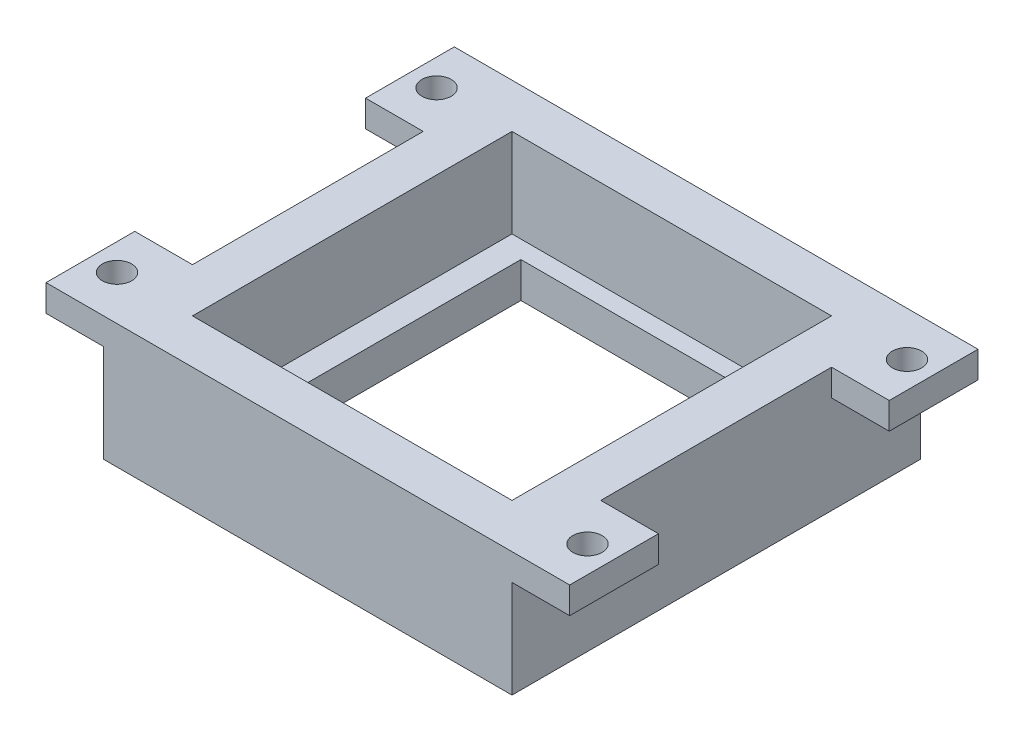
ISO-10303-21;
HEADER;
FILE_DESCRIPTION(('STEP AP214'),'2;1');
FILE_NAME('part.step','',(''),(''),'','','');
FILE_SCHEMA(('AUTOMOTIVE_DESIGN { 1 0 10303 214 1 1 1 1 }'));
ENDSEC;
DATA;
#1=APPLICATION_CONTEXT('core data for automotive mechanical design processes');
#2=APPLICATION_PROTOCOL_DEFINITION('international standard','automotive_design',2000,#1);
#3=PRODUCT_CONTEXT('',#1,'mechanical');
#4=PRODUCT('Part','Part','',(#3));
#5=PRODUCT_RELATED_PRODUCT_CATEGORY('part','',(#4));
#6=PRODUCT_DEFINITION_FORMATION('','',#4);
#7=PRODUCT_DEFINITION_CONTEXT('part definition',#1,'design');
#8=PRODUCT_DEFINITION('design','',#6,#7);
#9=PRODUCT_DEFINITION_SHAPE('','',#8);
#10=(LENGTH_UNIT() NAMED_UNIT(*) SI_UNIT(.MILLI.,.METRE.));
#11=(NAMED_UNIT(*) PLANE_ANGLE_UNIT() SI_UNIT($,.RADIAN.));
#12=(NAMED_UNIT(*) SI_UNIT($,.STERADIAN.) SOLID_ANGLE_UNIT());
#13=UNCERTAINTY_MEASURE_WITH_UNIT(LENGTH_MEASURE(1.E-05),#10,'distance_accuracy_value','');
#14=(GEOMETRIC_REPRESENTATION_CONTEXT(3) GLOBAL_UNCERTAINTY_ASSIGNED_CONTEXT((#13)) GLOBAL_UNIT_ASSIGNED_CONTEXT((#10,
#11,#12)) REPRESENTATION_CONTEXT('',''));
#15=CARTESIAN_POINT('',(0.,0.,0.));
#16=DIRECTION('',(0.,0.,1.));
#17=DIRECTION('',(1.,0.,0.));
#18=AXIS2_PLACEMENT_3D('',#15,#16,#17);
#19=CARTESIAN_POINT('',(-24.5,24.,74.));
#20=DIRECTION('',(0.,1.,0.));
#21=DIRECTION('',(0.,0.,1.));
#22=AXIS2_PLACEMENT_3D('',#19,#20,#21);
#23=PLANE('',#22);
#24=DIRECTION('',(0.,0.,-1.));
#25=VECTOR('',#24,1.);
#26=CARTESIAN_POINT('',(16.5,24.,69.));
#27=LINE('',#26,#25);
#28=CARTESIAN_POINT('',(16.5,24.,100.));
#29=VERTEX_POINT('',#28);
#30=CARTESIAN_POINT('',(16.5,24.,74.));
#31=VERTEX_POINT('',#30);
#32=EDGE_CURVE('E293',#29,#31,#27,.T.);
#33=ORIENTED_EDGE('',*,*,#32,.T.);
#34=DIRECTION('',(1.,0.,0.));
#35=VECTOR('',#34,1.);
#36=CARTESIAN_POINT('',(0.,24.,74.));
#37=LINE('',#36,#35);
#38=CARTESIAN_POINT('',(23.,24.,74.));
#39=VERTEX_POINT('',#38);
#40=EDGE_CURVE('E295',#31,#39,#37,.T.);
#41=ORIENTED_EDGE('',*,*,#40,.T.);
#42=DIRECTION('',(0.,0.,1.));
#43=VECTOR('',#42,1.);
#44=CARTESIAN_POINT('',(22.9999999999999,24.,174.));
#45=LINE('',#44,#43);
#46=CARTESIAN_POINT('',(23.,24.,64.));
#47=VERTEX_POINT('',#46);
#48=EDGE_CURVE('E328',#47,#39,#45,.T.);
#49=ORIENTED_EDGE('',*,*,#48,.F.);
#50=DIRECTION('',(1.,0.,0.));
#51=VECTOR('',#50,1.);
#52=CARTESIAN_POINT('',(-1.16228176058716,24.,64.));
#53=LINE('',#52,#51);
#54=CARTESIAN_POINT('',(-36.,24.,64.));
#55=VERTEX_POINT('',#54);
#56=EDGE_CURVE('E324',#55,#47,#53,.T.);
#57=ORIENTED_EDGE('',*,*,#56,.F.);
#58=DIRECTION('',(0.,0.,1.));
#59=VECTOR('',#58,1.);
#60=CARTESIAN_POINT('',(-36.,24.,174.));
#61=LINE('',#60,#59);
#62=CARTESIAN_POINT('',(-36.,24.,74.));
#63=VERTEX_POINT('',#62);
#64=EDGE_CURVE('E315',#55,#63,#61,.T.);
#65=ORIENTED_EDGE('',*,*,#64,.T.);
#66=CARTESIAN_POINT('',(-29.5,24.,74.));
#67=VERTEX_POINT('',#66);
#68=EDGE_CURVE('E311',#63,#67,#37,.T.);
#69=ORIENTED_EDGE('',*,*,#68,.T.);
#70=DIRECTION('',(0.,0.,1.));
#71=VECTOR('',#70,1.);
#72=CARTESIAN_POINT('',(-29.5,24.,69.));
#73=LINE('',#72,#71);
#74=CARTESIAN_POINT('',(-29.5,24.,100.));
#75=VERTEX_POINT('',#74);
#76=EDGE_CURVE('E300',#67,#75,#73,.T.);
#77=ORIENTED_EDGE('',*,*,#76,.T.);
#78=DIRECTION('',(1.,0.,0.));
#79=VECTOR('',#78,1.);
#80=CARTESIAN_POINT('',(0.,24.,100.));
#81=LINE('',#80,#79);
#82=CARTESIAN_POINT('',(-36.,24.,100.));
#83=VERTEX_POINT('',#82);
#84=EDGE_CURVE('E358',#83,#75,#81,.T.);
#85=ORIENTED_EDGE('',*,*,#84,.F.);
#86=DIRECTION('',(0.,0.,-1.));
#87=VECTOR('',#86,1.);
#88=CARTESIAN_POINT('',(-36.,24.,0.));
#89=LINE('',#88,#87);
#90=CARTESIAN_POINT('',(-36.,24.,110.));
#91=VERTEX_POINT('',#90);
#92=EDGE_CURVE('E356',#91,#83,#89,.T.);
#93=ORIENTED_EDGE('',*,*,#92,.F.);
#94=DIRECTION('',(-1.,0.,0.));
#95=VECTOR('',#94,1.);
#96=CARTESIAN_POINT('',(0.,24.,110.));
#97=LINE('',#96,#95);
#98=CARTESIAN_POINT('',(23.,24.,110.));
#99=VERTEX_POINT('',#98);
#100=EDGE_CURVE('E327',#99,#91,#97,.T.);
#101=ORIENTED_EDGE('',*,*,#100,.F.);
#102=DIRECTION('',(0.,0.,-1.));
#103=VECTOR('',#102,1.);
#104=CARTESIAN_POINT('',(22.9999999999999,24.,0.));
#105=LINE('',#104,#103);
#106=CARTESIAN_POINT('',(23.,24.,100.));
#107=VERTEX_POINT('',#106);
#108=EDGE_CURVE('E323',#99,#107,#105,.T.);
#109=ORIENTED_EDGE('',*,*,#108,.T.);
#110=EDGE_CURVE('E297',#29,#107,#81,.T.);
#111=ORIENTED_EDGE('',*,*,#110,.F.);
#112=EDGE_LOOP('',(#33,#41,#49,#57,#65,#69,#77,#85,#93,#101,#109,#111));
#113=FACE_BOUND('',#112,.T.);
#114=CARTESIAN_POINT('',(-33.,24.,105.));
#115=DIRECTION('',(0.,1.,0.));
#116=DIRECTION('',(0.,0.,1.));
#117=AXIS2_PLACEMENT_3D('',#114,#115,#116);
#118=CIRCLE('',#117,1.65);
#119=CARTESIAN_POINT('',(-33.,24.,106.65));
#120=VERTEX_POINT('',#119);
#121=EDGE_CURVE('E331',#120,#120,#118,.T.);
#122=ORIENTED_EDGE('',*,*,#121,.F.);
#123=EDGE_LOOP('',(#122));
#124=FACE_BOUND('',#123,.T.);
#125=CARTESIAN_POINT('',(20.,24.,105.));
#126=DIRECTION('',(0.,1.,0.));
#127=DIRECTION('',(0.,0.,1.));
#128=AXIS2_PLACEMENT_3D('',#125,#126,#127);
#129=CIRCLE('',#128,1.65);
#130=CARTESIAN_POINT('',(20.,24.,106.65));
#131=VERTEX_POINT('',#130);
#132=EDGE_CURVE('E353',#131,#131,#129,.T.);
#133=ORIENTED_EDGE('',*,*,#132,.F.);
#134=EDGE_LOOP('',(#133));
#135=FACE_BOUND('',#134,.T.);
#136=DIRECTION('',(0.,0.,-1.));
#137=VECTOR('',#136,1.);
#138=CARTESIAN_POINT('',(11.5,24.,69.));
#139=LINE('',#138,#137);
#140=CARTESIAN_POINT('',(11.5,24.,105.));
#141=VERTEX_POINT('',#140);
#142=CARTESIAN_POINT('',(11.5,24.,69.));
#143=VERTEX_POINT('',#142);
#144=EDGE_CURVE('E131',#141,#143,#139,.T.);
#145=ORIENTED_EDGE('',*,*,#144,.F.);
#146=DIRECTION('',(1.,0.,0.));
#147=VECTOR('',#146,1.);
#148=CARTESIAN_POINT('',(-24.5,24.,105.));
#149=LINE('',#148,#147);
#150=CARTESIAN_POINT('',(-24.5,24.,105.));
#151=VERTEX_POINT('',#150);
#152=EDGE_CURVE('E334',#151,#141,#149,.T.);
#153=ORIENTED_EDGE('',*,*,#152,.F.);
#154=DIRECTION('',(0.,0.,1.));
#155=VECTOR('',#154,1.);
#156=CARTESIAN_POINT('',(-24.5,24.,69.));
#157=LINE('',#156,#155);
#158=CARTESIAN_POINT('',(-24.5,24.,69.));
#159=VERTEX_POINT('',#158);
#160=EDGE_CURVE('E336',#159,#151,#157,.T.);
#161=ORIENTED_EDGE('',*,*,#160,.F.);
#162=DIRECTION('',(-1.,0.,0.));
#163=VECTOR('',#162,1.);
#164=CARTESIAN_POINT('',(-24.5,24.,69.));
#165=LINE('',#164,#163);
#166=EDGE_CURVE('E332',#143,#159,#165,.T.);
#167=ORIENTED_EDGE('',*,*,#166,.F.);
#168=EDGE_LOOP('',(#145,#153,#161,#167));
#169=FACE_BOUND('',#168,.T.);
#170=CARTESIAN_POINT('',(-33.,24.,69.));
#171=DIRECTION('',(0.,1.,0.));
#172=DIRECTION('',(0.,0.,1.));
#173=AXIS2_PLACEMENT_3D('',#170,#171,#172);
#174=CIRCLE('',#173,1.65);
#175=CARTESIAN_POINT('',(-33.,24.,70.65));
#176=VERTEX_POINT('',#175);
#177=EDGE_CURVE('E317',#176,#176,#174,.F.);
#178=ORIENTED_EDGE('',*,*,#177,.T.);
#179=EDGE_LOOP('',(#178));
#180=FACE_BOUND('',#179,.T.);
#181=CARTESIAN_POINT('',(20.,24.,69.));
#182=DIRECTION('',(0.,1.,0.));
#183=DIRECTION('',(0.,0.,1.));
#184=AXIS2_PLACEMENT_3D('',#181,#182,#183);
#185=CIRCLE('',#184,1.65);
#186=CARTESIAN_POINT('',(20.,24.,70.65));
#187=VERTEX_POINT('',#186);
#188=EDGE_CURVE('E312',#187,#187,#185,.F.);
#189=ORIENTED_EDGE('',*,*,#188,.T.);
#190=EDGE_LOOP('',(#189));
#191=FACE_BOUND('',#190,.T.);
#192=ADVANCED_FACE('F127',(#113,#124,#135,#169,#180,#191),#23,.T.);
#193=CARTESIAN_POINT('',(-21.5,-1.,102.));
#194=DIRECTION('',(0.,0.,1.));
#195=DIRECTION('',(1.,0.,0.));
#196=AXIS2_PLACEMENT_3D('',#193,#194,#195);
#197=PLANE('',#196);
#198=DIRECTION('',(-1.,0.,0.));
#199=VECTOR('',#198,1.);
#200=CARTESIAN_POINT('',(-28.5,10.,102.));
#201=LINE('',#200,#199);
#202=CARTESIAN_POINT('',(8.5,10.,102.));
#203=VERTEX_POINT('',#202);
#204=CARTESIAN_POINT('',(-21.5,10.,102.));
#205=VERTEX_POINT('',#204);
#206=EDGE_CURVE('E634',#203,#205,#201,.T.);
#207=ORIENTED_EDGE('',*,*,#206,.T.);
#208=DIRECTION('',(0.,1.,0.));
#209=VECTOR('',#208,1.);
#210=CARTESIAN_POINT('',(-21.5,-1.,102.));
#211=LINE('',#210,#209);
#212=CARTESIAN_POINT('',(-21.5,14.,102.));
#213=VERTEX_POINT('',#212);
#214=EDGE_CURVE('E624',#205,#213,#211,.T.);
#215=ORIENTED_EDGE('',*,*,#214,.T.);
#216=DIRECTION('',(1.,0.,0.));
#217=VECTOR('',#216,1.);
#218=CARTESIAN_POINT('',(-21.5,14.,102.));
#219=LINE('',#218,#217);
#220=CARTESIAN_POINT('',(8.5,14.,102.));
#221=VERTEX_POINT('',#220);
#222=EDGE_CURVE('E613',#213,#221,#219,.T.);
#223=ORIENTED_EDGE('',*,*,#222,.T.);
#224=DIRECTION('',(0.,1.,0.));
#225=VECTOR('',#224,1.);
#226=CARTESIAN_POINT('',(8.5,-1.,102.));
#227=LINE('',#226,#225);
#228=EDGE_CURVE('E630',#203,#221,#227,.T.);
#229=ORIENTED_EDGE('',*,*,#228,.F.);
#230=EDGE_LOOP('',(#207,#215,#223,#229));
#231=FACE_BOUND('',#230,.T.);
#232=ADVANCED_FACE('F402',(#231),#197,.F.);
#233=CARTESIAN_POINT('',(8.5,-1.,71.));
#234=DIRECTION('',(1.,0.,0.));
#235=DIRECTION('',(0.,0.,-1.));
#236=AXIS2_PLACEMENT_3D('',#233,#234,#235);
#237=PLANE('',#236);
#238=DIRECTION('',(0.,0.,1.));
#239=VECTOR('',#238,1.);
#240=CARTESIAN_POINT('',(8.5,10.,-3.));
#241=LINE('',#240,#239);
#242=CARTESIAN_POINT('',(8.5,10.,71.));
#243=VERTEX_POINT('',#242);
#244=EDGE_CURVE('E636',#243,#203,#241,.T.);
#245=ORIENTED_EDGE('',*,*,#244,.T.);
#246=ORIENTED_EDGE('',*,*,#228,.T.);
#247=DIRECTION('',(0.,0.,-1.));
#248=VECTOR('',#247,1.);
#249=CARTESIAN_POINT('',(8.5,14.,71.));
#250=LINE('',#249,#248);
#251=CARTESIAN_POINT('',(8.5,14.,71.));
#252=VERTEX_POINT('',#251);
#253=EDGE_CURVE('E618',#221,#252,#250,.T.);
#254=ORIENTED_EDGE('',*,*,#253,.T.);
#255=DIRECTION('',(0.,1.,0.));
#256=VECTOR('',#255,1.);
#257=CARTESIAN_POINT('',(8.5,-1.,71.));
#258=LINE('',#257,#256);
#259=EDGE_CURVE('E627',#243,#252,#258,.T.);
#260=ORIENTED_EDGE('',*,*,#259,.F.);
#261=EDGE_LOOP('',(#245,#246,#254,#260));
#262=FACE_BOUND('',#261,.T.);
#263=ADVANCED_FACE('F404',(#262),#237,.F.);
#264=CARTESIAN_POINT('',(-21.5,-1.,71.));
#265=DIRECTION('',(0.,0.,-1.));
#266=DIRECTION('',(-1.,0.,0.));
#267=AXIS2_PLACEMENT_3D('',#264,#265,#266);
#268=PLANE('',#267);
#269=DIRECTION('',(1.,0.,0.));
#270=VECTOR('',#269,1.);
#271=CARTESIAN_POINT('',(-28.5,10.,71.));
#272=LINE('',#271,#270);
#273=CARTESIAN_POINT('',(-21.5,10.,71.));
#274=VERTEX_POINT('',#273);
#275=EDGE_CURVE('E628',#274,#243,#272,.T.);
#276=ORIENTED_EDGE('',*,*,#275,.T.);
#277=ORIENTED_EDGE('',*,*,#259,.T.);
#278=DIRECTION('',(-1.,0.,0.));
#279=VECTOR('',#278,1.);
#280=CARTESIAN_POINT('',(-21.5,14.,71.));
#281=LINE('',#280,#279);
#282=CARTESIAN_POINT('',(-21.5,14.,71.));
#283=VERTEX_POINT('',#282);
#284=EDGE_CURVE('E611',#252,#283,#281,.T.);
#285=ORIENTED_EDGE('',*,*,#284,.T.);
#286=DIRECTION('',(0.,1.,0.));
#287=VECTOR('',#286,1.);
#288=CARTESIAN_POINT('',(-21.5,-1.,71.));
#289=LINE('',#288,#287);
#290=EDGE_CURVE('E625',#274,#283,#289,.T.);
#291=ORIENTED_EDGE('',*,*,#290,.F.);
#292=EDGE_LOOP('',(#276,#277,#285,#291));
#293=FACE_BOUND('',#292,.T.);
#294=ADVANCED_FACE('F411',(#293),#268,.F.);
#295=CARTESIAN_POINT('',(-21.5,-1.,71.));
#296=DIRECTION('',(-1.,0.,0.));
#297=DIRECTION('',(0.,0.,1.));
#298=AXIS2_PLACEMENT_3D('',#295,#296,#297);
#299=PLANE('',#298);
#300=DIRECTION('',(0.,0.,-1.));
#301=VECTOR('',#300,1.);
#302=CARTESIAN_POINT('',(-21.5,10.,-3.));
#303=LINE('',#302,#301);
#304=EDGE_CURVE('E638',#205,#274,#303,.T.);
#305=ORIENTED_EDGE('',*,*,#304,.T.);
#306=ORIENTED_EDGE('',*,*,#290,.T.);
#307=DIRECTION('',(0.,0.,1.));
#308=VECTOR('',#307,1.);
#309=CARTESIAN_POINT('',(-21.5,14.,71.));
#310=LINE('',#309,#308);
#311=EDGE_CURVE('E609',#283,#213,#310,.T.);
#312=ORIENTED_EDGE('',*,*,#311,.T.);
#313=ORIENTED_EDGE('',*,*,#214,.F.);
#314=EDGE_LOOP('',(#305,#306,#312,#313));
#315=FACE_BOUND('',#314,.T.);
#316=ADVANCED_FACE('F417',(#315),#299,.F.);
#317=CARTESIAN_POINT('',(-24.5,24.,69.));
#318=DIRECTION('',(1.,0.,0.));
#319=DIRECTION('',(0.,0.,-1.));
#320=AXIS2_PLACEMENT_3D('',#317,#318,#319);
#321=PLANE('',#320);
#322=DIRECTION('',(0.,0.,1.));
#323=VECTOR('',#322,1.);
#324=CARTESIAN_POINT('',(-24.5,14.,69.));
#325=LINE('',#324,#323);
#326=CARTESIAN_POINT('',(-24.5,14.,69.));
#327=VERTEX_POINT('',#326);
#328=CARTESIAN_POINT('',(-24.5,14.,105.));
#329=VERTEX_POINT('',#328);
#330=EDGE_CURVE('E561',#327,#329,#325,.T.);
#331=ORIENTED_EDGE('',*,*,#330,.F.);
#332=DIRECTION('',(0.,-1.,0.));
#333=VECTOR('',#332,1.);
#334=CARTESIAN_POINT('',(-24.5,24.,69.));
#335=LINE('',#334,#333);
#336=EDGE_CURVE('E335',#159,#327,#335,.T.);
#337=ORIENTED_EDGE('',*,*,#336,.F.);
#338=ORIENTED_EDGE('',*,*,#160,.T.);
#339=DIRECTION('',(0.,-1.,0.));
#340=VECTOR('',#339,1.);
#341=CARTESIAN_POINT('',(-24.5,24.,105.));
#342=LINE('',#341,#340);
#343=EDGE_CURVE('E547',#151,#329,#342,.T.);
#344=ORIENTED_EDGE('',*,*,#343,.T.);
#345=EDGE_LOOP('',(#331,#337,#338,#344));
#346=FACE_BOUND('',#345,.T.);
#347=ADVANCED_FACE('F423',(#346),#321,.T.);
#348=CARTESIAN_POINT('',(-24.5,24.,69.));
#349=DIRECTION('',(0.,0.,1.));
#350=DIRECTION('',(1.,0.,0.));
#351=AXIS2_PLACEMENT_3D('',#348,#349,#350);
#352=PLANE('',#351);
#353=DIRECTION('',(-1.,0.,0.));
#354=VECTOR('',#353,1.);
#355=CARTESIAN_POINT('',(-24.5,14.,69.));
#356=LINE('',#355,#354);
#357=CARTESIAN_POINT('',(11.5,14.,69.));
#358=VERTEX_POINT('',#357);
#359=EDGE_CURVE('E337',#358,#327,#356,.T.);
#360=ORIENTED_EDGE('',*,*,#359,.F.);
#361=DIRECTION('',(0.,-1.,0.));
#362=VECTOR('',#361,1.);
#363=CARTESIAN_POINT('',(11.5,24.,69.));
#364=LINE('',#363,#362);
#365=EDGE_CURVE('E551',#143,#358,#364,.T.);
#366=ORIENTED_EDGE('',*,*,#365,.F.);
#367=ORIENTED_EDGE('',*,*,#166,.T.);
#368=ORIENTED_EDGE('',*,*,#336,.T.);
#369=EDGE_LOOP('',(#360,#366,#367,#368));
#370=FACE_BOUND('',#369,.T.);
#371=ADVANCED_FACE('F426',(#370),#352,.T.);
#372=CARTESIAN_POINT('',(-24.5,24.,105.));
#373=DIRECTION('',(0.,0.,-1.));
#374=DIRECTION('',(-1.,0.,0.));
#375=AXIS2_PLACEMENT_3D('',#372,#373,#374);
#376=PLANE('',#375);
#377=DIRECTION('',(1.,0.,0.));
#378=VECTOR('',#377,1.);
#379=CARTESIAN_POINT('',(-24.5,14.,105.));
#380=LINE('',#379,#378);
#381=CARTESIAN_POINT('',(11.5,14.,105.));
#382=VERTEX_POINT('',#381);
#383=EDGE_CURVE('E558',#329,#382,#380,.T.);
#384=ORIENTED_EDGE('',*,*,#383,.F.);
#385=ORIENTED_EDGE('',*,*,#343,.F.);
#386=ORIENTED_EDGE('',*,*,#152,.T.);
#387=DIRECTION('',(0.,-1.,0.));
#388=VECTOR('',#387,1.);
#389=CARTESIAN_POINT('',(11.5,24.,105.));
#390=LINE('',#389,#388);
#391=EDGE_CURVE('E549',#141,#382,#390,.T.);
#392=ORIENTED_EDGE('',*,*,#391,.T.);
#393=EDGE_LOOP('',(#384,#385,#386,#392));
#394=FACE_BOUND('',#393,.T.);
#395=ADVANCED_FACE('F427',(#394),#376,.T.);
#396=CARTESIAN_POINT('',(0.,14.,0.));
#397=DIRECTION('',(0.,1.,0.));
#398=DIRECTION('',(0.,0.,1.));
#399=AXIS2_PLACEMENT_3D('',#396,#397,#398);
#400=PLANE('',#399);
#401=DIRECTION('',(0.,0.,-1.));
#402=VECTOR('',#401,1.);
#403=CARTESIAN_POINT('',(11.5,14.,69.));
#404=LINE('',#403,#402);
#405=EDGE_CURVE('E342',#382,#358,#404,.T.);
#406=ORIENTED_EDGE('',*,*,#405,.T.);
#407=ORIENTED_EDGE('',*,*,#359,.T.);
#408=ORIENTED_EDGE('',*,*,#330,.T.);
#409=ORIENTED_EDGE('',*,*,#383,.T.);
#410=EDGE_LOOP('',(#406,#407,#408,#409));
#411=FACE_BOUND('',#410,.T.);
#412=ORIENTED_EDGE('',*,*,#311,.F.);
#413=ORIENTED_EDGE('',*,*,#284,.F.);
#414=ORIENTED_EDGE('',*,*,#253,.F.);
#415=ORIENTED_EDGE('',*,*,#222,.F.);
#416=EDGE_LOOP('',(#412,#413,#414,#415));
#417=FACE_BOUND('',#416,.T.);
#418=ADVANCED_FACE('F430',(#411,#417),#400,.T.);
#419=CARTESIAN_POINT('',(11.5,24.,69.));
#420=DIRECTION('',(-1.,0.,0.));
#421=DIRECTION('',(0.,0.,1.));
#422=AXIS2_PLACEMENT_3D('',#419,#420,#421);
#423=PLANE('',#422);
#424=ORIENTED_EDGE('',*,*,#405,.F.);
#425=ORIENTED_EDGE('',*,*,#391,.F.);
#426=ORIENTED_EDGE('',*,*,#144,.T.);
#427=ORIENTED_EDGE('',*,*,#365,.T.);
#428=EDGE_LOOP('',(#424,#425,#426,#427));
#429=FACE_BOUND('',#428,.T.);
#430=ADVANCED_FACE('F431',(#429),#423,.T.);
#431=CARTESIAN_POINT('',(-28.5,10.,-3.));
#432=DIRECTION('',(0.,-1.,0.));
#433=DIRECTION('',(0.,0.,-1.));
#434=AXIS2_PLACEMENT_3D('',#431,#432,#433);
#435=PLANE('',#434);
#436=ORIENTED_EDGE('',*,*,#275,.F.);
#437=ORIENTED_EDGE('',*,*,#304,.F.);
#438=ORIENTED_EDGE('',*,*,#206,.F.);
#439=ORIENTED_EDGE('',*,*,#244,.F.);
#440=EDGE_LOOP('',(#436,#437,#438,#439));
#441=FACE_BOUND('',#440,.T.);
#442=DIRECTION('',(1.,0.,0.));
#443=VECTOR('',#442,1.);
#444=CARTESIAN_POINT('',(-28.5,10.,64.));
#445=LINE('',#444,#443);
#446=CARTESIAN_POINT('',(-29.5,10.,64.));
#447=VERTEX_POINT('',#446);
#448=CARTESIAN_POINT('',(16.5,10.,64.));
#449=VERTEX_POINT('',#448);
#450=EDGE_CURVE('E330',#447,#449,#445,.T.);
#451=ORIENTED_EDGE('',*,*,#450,.T.);
#452=DIRECTION('',(0.,0.,1.));
#453=VECTOR('',#452,1.);
#454=CARTESIAN_POINT('',(16.5,10.,-3.));
#455=LINE('',#454,#453);
#456=CARTESIAN_POINT('',(16.5,9.99999999999999,110.));
#457=VERTEX_POINT('',#456);
#458=EDGE_CURVE('E366',#449,#457,#455,.T.);
#459=ORIENTED_EDGE('',*,*,#458,.T.);
#460=DIRECTION('',(1.,0.,0.));
#461=VECTOR('',#460,1.);
#462=CARTESIAN_POINT('',(-31.5,9.99999999999999,110.));
#463=LINE('',#462,#461);
#464=CARTESIAN_POINT('',(-29.5,9.99999999999999,110.));
#465=VERTEX_POINT('',#464);
#466=EDGE_CURVE('E641',#465,#457,#463,.T.);
#467=ORIENTED_EDGE('',*,*,#466,.F.);
#468=DIRECTION('',(0.,0.,-1.));
#469=VECTOR('',#468,1.);
#470=CARTESIAN_POINT('',(-29.5,10.,-3.));
#471=LINE('',#470,#469);
#472=EDGE_CURVE('E564',#465,#447,#471,.T.);
#473=ORIENTED_EDGE('',*,*,#472,.T.);
#474=EDGE_LOOP('',(#451,#459,#467,#473));
#475=FACE_BOUND('',#474,.T.);
#476=ADVANCED_FACE('F434',(#441,#475),#435,.T.);
#477=CARTESIAN_POINT('',(0.,21.,0.));
#478=DIRECTION('',(0.,-1.,0.));
#479=DIRECTION('',(0.,0.,-1.));
#480=AXIS2_PLACEMENT_3D('',#477,#478,#479);
#481=PLANE('',#480);
#482=CARTESIAN_POINT('',(20.,21.,105.));
#483=DIRECTION('',(0.,-1.,0.));
#484=DIRECTION('',(0.,0.,-1.));
#485=AXIS2_PLACEMENT_3D('',#482,#483,#484);
#486=CIRCLE('',#485,1.65);
#487=CARTESIAN_POINT('',(20.,21.,103.35));
#488=VERTEX_POINT('',#487);
#489=EDGE_CURVE('E581',#488,#488,#486,.F.);
#490=ORIENTED_EDGE('',*,*,#489,.T.);
#491=EDGE_LOOP('',(#490));
#492=FACE_BOUND('',#491,.T.);
#493=DIRECTION('',(0.,0.,1.));
#494=VECTOR('',#493,1.);
#495=CARTESIAN_POINT('',(23.,21.,100.));
#496=LINE('',#495,#494);
#497=CARTESIAN_POINT('',(23.,21.,100.));
#498=VERTEX_POINT('',#497);
#499=CARTESIAN_POINT('',(23.,21.,110.));
#500=VERTEX_POINT('',#499);
#501=EDGE_CURVE('E584',#498,#500,#496,.T.);
#502=ORIENTED_EDGE('',*,*,#501,.T.);
#503=DIRECTION('',(-1.,0.,0.));
#504=VECTOR('',#503,1.);
#505=CARTESIAN_POINT('',(23.,21.,110.));
#506=LINE('',#505,#504);
#507=CARTESIAN_POINT('',(16.5,21.,110.));
#508=VERTEX_POINT('',#507);
#509=EDGE_CURVE('E587',#500,#508,#506,.T.);
#510=ORIENTED_EDGE('',*,*,#509,.T.);
#511=DIRECTION('',(0.,0.,-1.));
#512=VECTOR('',#511,1.);
#513=CARTESIAN_POINT('',(16.5,21.,110.));
#514=LINE('',#513,#512);
#515=CARTESIAN_POINT('',(16.5,21.,100.));
#516=VERTEX_POINT('',#515);
#517=EDGE_CURVE('E590',#508,#516,#514,.T.);
#518=ORIENTED_EDGE('',*,*,#517,.T.);
#519=DIRECTION('',(1.,0.,0.));
#520=VECTOR('',#519,1.);
#521=CARTESIAN_POINT('',(16.5,21.,100.));
#522=LINE('',#521,#520);
#523=EDGE_CURVE('E592',#516,#498,#522,.T.);
#524=ORIENTED_EDGE('',*,*,#523,.T.);
#525=EDGE_LOOP('',(#502,#510,#518,#524));
#526=FACE_BOUND('',#525,.T.);
#527=ADVANCED_FACE('F445',(#492,#526),#481,.T.);
#528=CARTESIAN_POINT('',(20.,27.,105.));
#529=DIRECTION('',(0.,-1.,0.));
#530=DIRECTION('',(0.,0.,-1.));
#531=AXIS2_PLACEMENT_3D('',#528,#529,#530);
#532=CYLINDRICAL_SURFACE('',#531,1.65);
#533=ORIENTED_EDGE('',*,*,#489,.F.);
#534=EDGE_LOOP('',(#533));
#535=FACE_BOUND('',#534,.T.);
#536=ORIENTED_EDGE('',*,*,#132,.T.);
#537=EDGE_LOOP('',(#536));
#538=FACE_BOUND('',#537,.T.);
#539=ADVANCED_FACE('F447',(#535,#538),#532,.F.);
#540=CARTESIAN_POINT('',(22.9999999999999,27.,0.));
#541=DIRECTION('',(-1.,0.,0.));
#542=DIRECTION('',(0.,0.,1.));
#543=AXIS2_PLACEMENT_3D('',#540,#541,#542);
#544=PLANE('',#543);
#545=ORIENTED_EDGE('',*,*,#108,.F.);
#546=DIRECTION('',(0.,-1.,0.));
#547=VECTOR('',#546,1.);
#548=CARTESIAN_POINT('',(23.,27.,110.));
#549=LINE('',#548,#547);
#550=EDGE_CURVE('E370',#99,#500,#549,.T.);
#551=ORIENTED_EDGE('',*,*,#550,.T.);
#552=ORIENTED_EDGE('',*,*,#501,.F.);
#553=DIRECTION('',(0.,-1.,0.));
#554=VECTOR('',#553,1.);
#555=CARTESIAN_POINT('',(23.,27.,100.));
#556=LINE('',#555,#554);
#557=EDGE_CURVE('E363',#107,#498,#556,.T.);
#558=ORIENTED_EDGE('',*,*,#557,.F.);
#559=EDGE_LOOP('',(#545,#551,#552,#558));
#560=FACE_BOUND('',#559,.T.);
#561=ADVANCED_FACE('F460',(#560),#544,.F.);
#562=CARTESIAN_POINT('',(-1.16228176058716,14.,64.));
#563=DIRECTION('',(0.,0.,-1.));
#564=DIRECTION('',(-1.,0.,0.));
#565=AXIS2_PLACEMENT_3D('',#562,#563,#564);
#566=PLANE('',#565);
#567=DIRECTION('',(0.,-1.,0.));
#568=VECTOR('',#567,1.);
#569=CARTESIAN_POINT('',(-36.,27.,64.));
#570=LINE('',#569,#568);
#571=CARTESIAN_POINT('',(-36.,21.,64.));
#572=VERTEX_POINT('',#571);
#573=EDGE_CURVE('E377',#55,#572,#570,.T.);
#574=ORIENTED_EDGE('',*,*,#573,.F.);
#575=ORIENTED_EDGE('',*,*,#56,.T.);
#576=DIRECTION('',(0.,-1.,0.));
#577=VECTOR('',#576,1.);
#578=CARTESIAN_POINT('',(23.,27.,64.));
#579=LINE('',#578,#577);
#580=CARTESIAN_POINT('',(23.,21.,64.));
#581=VERTEX_POINT('',#580);
#582=EDGE_CURVE('E379',#47,#581,#579,.T.);
#583=ORIENTED_EDGE('',*,*,#582,.T.);
#584=DIRECTION('',(-1.,0.,0.));
#585=VECTOR('',#584,1.);
#586=CARTESIAN_POINT('',(23.,21.,64.));
#587=LINE('',#586,#585);
#588=CARTESIAN_POINT('',(16.5,21.,64.));
#589=VERTEX_POINT('',#588);
#590=EDGE_CURVE('E307',#581,#589,#587,.T.);
#591=ORIENTED_EDGE('',*,*,#590,.T.);
#592=DIRECTION('',(0.,-1.,0.));
#593=VECTOR('',#592,1.);
#594=CARTESIAN_POINT('',(16.5,24.,64.));
#595=LINE('',#594,#593);
#596=EDGE_CURVE('E535',#589,#449,#595,.T.);
#597=ORIENTED_EDGE('',*,*,#596,.T.);
#598=ORIENTED_EDGE('',*,*,#450,.F.);
#599=DIRECTION('',(0.,-1.,0.));
#600=VECTOR('',#599,1.);
#601=CARTESIAN_POINT('',(-29.5,24.,64.));
#602=LINE('',#601,#600);
#603=CARTESIAN_POINT('',(-29.5,21.,64.));
#604=VERTEX_POINT('',#603);
#605=EDGE_CURVE('E301',#604,#447,#602,.T.);
#606=ORIENTED_EDGE('',*,*,#605,.F.);
#607=DIRECTION('',(-1.,0.,0.));
#608=VECTOR('',#607,1.);
#609=CARTESIAN_POINT('',(-29.5,21.,64.));
#610=LINE('',#609,#608);
#611=EDGE_CURVE('E519',#604,#572,#610,.T.);
#612=ORIENTED_EDGE('',*,*,#611,.T.);
#613=EDGE_LOOP('',(#574,#575,#583,#591,#597,#598,#606,#612));
#614=FACE_BOUND('',#613,.T.);
#615=ADVANCED_FACE('F463',(#614),#566,.T.);
#616=CARTESIAN_POINT('',(-29.5,14.,110.));
#617=DIRECTION('',(-1.,0.,0.));
#618=DIRECTION('',(0.,0.,1.));
#619=AXIS2_PLACEMENT_3D('',#616,#617,#618);
#620=PLANE('',#619);
#621=DIRECTION('',(0.,1.,0.));
#622=VECTOR('',#621,1.);
#623=CARTESIAN_POINT('',(-29.5,21.,74.));
#624=LINE('',#623,#622);
#625=CARTESIAN_POINT('',(-29.5,21.,74.));
#626=VERTEX_POINT('',#625);
#627=EDGE_CURVE('E374',#626,#67,#624,.T.);
#628=ORIENTED_EDGE('',*,*,#627,.F.);
#629=DIRECTION('',(0.,0.,-1.));
#630=VECTOR('',#629,1.);
#631=CARTESIAN_POINT('',(-29.5,21.,74.));
#632=LINE('',#631,#630);
#633=EDGE_CURVE('E506',#626,#604,#632,.T.);
#634=ORIENTED_EDGE('',*,*,#633,.T.);
#635=ORIENTED_EDGE('',*,*,#605,.T.);
#636=ORIENTED_EDGE('',*,*,#472,.F.);
#637=DIRECTION('',(0.,-1.,0.));
#638=VECTOR('',#637,1.);
#639=CARTESIAN_POINT('',(-29.5,24.,110.));
#640=LINE('',#639,#638);
#641=CARTESIAN_POINT('',(-29.5,21.,110.));
#642=VERTEX_POINT('',#641);
#643=EDGE_CURVE('E542',#642,#465,#640,.T.);
#644=ORIENTED_EDGE('',*,*,#643,.F.);
#645=DIRECTION('',(0.,0.,1.));
#646=VECTOR('',#645,1.);
#647=CARTESIAN_POINT('',(-29.5,21.,100.));
#648=LINE('',#647,#646);
#649=CARTESIAN_POINT('',(-29.5,21.,100.));
#650=VERTEX_POINT('',#649);
#651=EDGE_CURVE('E569',#650,#642,#648,.T.);
#652=ORIENTED_EDGE('',*,*,#651,.F.);
#653=DIRECTION('',(0.,1.,0.));
#654=VECTOR('',#653,1.);
#655=CARTESIAN_POINT('',(-29.5,21.,100.));
#656=LINE('',#655,#654);
#657=EDGE_CURVE('E372',#650,#75,#656,.T.);
#658=ORIENTED_EDGE('',*,*,#657,.T.);
#659=ORIENTED_EDGE('',*,*,#76,.F.);
#660=EDGE_LOOP('',(#628,#634,#635,#636,#644,#652,#658,#659));
#661=FACE_BOUND('',#660,.T.);
#662=ADVANCED_FACE('F397',(#661),#620,.T.);
#663=CARTESIAN_POINT('',(0.,21.,174.));
#664=DIRECTION('',(0.,-1.,0.));
#665=DIRECTION('',(0.,0.,1.));
#666=AXIS2_PLACEMENT_3D('',#663,#664,#665);
#667=PLANE('',#666);
#668=CARTESIAN_POINT('',(-33.,21.,69.));
#669=DIRECTION('',(0.,1.,0.));
#670=DIRECTION('',(0.,0.,1.));
#671=AXIS2_PLACEMENT_3D('',#668,#669,#670);
#672=CIRCLE('',#671,1.65);
#673=CARTESIAN_POINT('',(-33.,21.,70.65));
#674=VERTEX_POINT('',#673);
#675=EDGE_CURVE('E308',#674,#674,#672,.T.);
#676=ORIENTED_EDGE('',*,*,#675,.T.);
#677=EDGE_LOOP('',(#676));
#678=FACE_BOUND('',#677,.T.);
#679=DIRECTION('',(0.,0.,1.));
#680=VECTOR('',#679,1.);
#681=CARTESIAN_POINT('',(-36.,21.,64.));
#682=LINE('',#681,#680);
#683=CARTESIAN_POINT('',(-36.,21.,74.));
#684=VERTEX_POINT('',#683);
#685=EDGE_CURVE('E522',#572,#684,#682,.T.);
#686=ORIENTED_EDGE('',*,*,#685,.F.);
#687=ORIENTED_EDGE('',*,*,#611,.F.);
#688=ORIENTED_EDGE('',*,*,#633,.F.);
#689=DIRECTION('',(1.,0.,0.));
#690=VECTOR('',#689,1.);
#691=CARTESIAN_POINT('',(-36.,21.,74.));
#692=LINE('',#691,#690);
#693=EDGE_CURVE('E511',#684,#626,#692,.T.);
#694=ORIENTED_EDGE('',*,*,#693,.F.);
#695=EDGE_LOOP('',(#686,#687,#688,#694));
#696=FACE_BOUND('',#695,.T.);
#697=ADVANCED_FACE('F388',(#678,#696),#667,.T.);
#698=CARTESIAN_POINT('',(-33.,27.,69.));
#699=DIRECTION('',(0.,-1.,0.));
#700=DIRECTION('',(0.,0.,-1.));
#701=AXIS2_PLACEMENT_3D('',#698,#699,#700);
#702=CYLINDRICAL_SURFACE('',#701,1.65);
#703=ORIENTED_EDGE('',*,*,#675,.F.);
#704=EDGE_LOOP('',(#703));
#705=FACE_BOUND('',#704,.T.);
#706=ORIENTED_EDGE('',*,*,#177,.F.);
#707=EDGE_LOOP('',(#706));
#708=FACE_BOUND('',#707,.T.);
#709=ADVANCED_FACE('F385',(#705,#708),#702,.F.);
#710=CARTESIAN_POINT('',(-36.,27.,174.));
#711=DIRECTION('',(1.,0.,0.));
#712=DIRECTION('',(0.,0.,-1.));
#713=AXIS2_PLACEMENT_3D('',#710,#711,#712);
#714=PLANE('',#713);
#715=ORIENTED_EDGE('',*,*,#64,.F.);
#716=ORIENTED_EDGE('',*,*,#573,.T.);
#717=ORIENTED_EDGE('',*,*,#685,.T.);
#718=DIRECTION('',(0.,-1.,0.));
#719=VECTOR('',#718,1.);
#720=CARTESIAN_POINT('',(-36.,27.,74.));
#721=LINE('',#720,#719);
#722=EDGE_CURVE('E375',#63,#684,#721,.T.);
#723=ORIENTED_EDGE('',*,*,#722,.F.);
#724=EDGE_LOOP('',(#715,#716,#717,#723));
#725=FACE_BOUND('',#724,.T.);
#726=ADVANCED_FACE('F387',(#725),#714,.F.);
#727=CARTESIAN_POINT('',(0.,27.,74.));
#728=DIRECTION('',(0.,0.,-1.));
#729=DIRECTION('',(-1.,0.,0.));
#730=AXIS2_PLACEMENT_3D('',#727,#728,#729);
#731=PLANE('',#730);
#732=ORIENTED_EDGE('',*,*,#68,.F.);
#733=ORIENTED_EDGE('',*,*,#722,.T.);
#734=ORIENTED_EDGE('',*,*,#693,.T.);
#735=ORIENTED_EDGE('',*,*,#627,.T.);
#736=EDGE_LOOP('',(#732,#733,#734,#735));
#737=FACE_BOUND('',#736,.T.);
#738=ADVANCED_FACE('F394',(#737),#731,.F.);
#739=CARTESIAN_POINT('',(22.9999999999999,27.,174.));
#740=DIRECTION('',(1.,0.,0.));
#741=DIRECTION('',(0.,0.,-1.));
#742=AXIS2_PLACEMENT_3D('',#739,#740,#741);
#743=PLANE('',#742);
#744=ORIENTED_EDGE('',*,*,#582,.F.);
#745=ORIENTED_EDGE('',*,*,#48,.T.);
#746=DIRECTION('',(0.,-1.,0.));
#747=VECTOR('',#746,1.);
#748=CARTESIAN_POINT('',(23.,27.,74.));
#749=LINE('',#748,#747);
#750=CARTESIAN_POINT('',(23.,21.,74.));
#751=VERTEX_POINT('',#750);
#752=EDGE_CURVE('E144',#39,#751,#749,.T.);
#753=ORIENTED_EDGE('',*,*,#752,.T.);
#754=DIRECTION('',(0.,0.,-1.));
#755=VECTOR('',#754,1.);
#756=CARTESIAN_POINT('',(23.,21.,74.));
#757=LINE('',#756,#755);
#758=EDGE_CURVE('E136',#751,#581,#757,.T.);
#759=ORIENTED_EDGE('',*,*,#758,.T.);
#760=EDGE_LOOP('',(#744,#745,#753,#759));
#761=FACE_BOUND('',#760,.T.);
#762=ADVANCED_FACE('F453',(#761),#743,.T.);
#763=CARTESIAN_POINT('',(0.,21.,174.));
#764=DIRECTION('',(0.,-1.,0.));
#765=DIRECTION('',(0.,0.,1.));
#766=AXIS2_PLACEMENT_3D('',#763,#764,#765);
#767=PLANE('',#766);
#768=ORIENTED_EDGE('',*,*,#758,.F.);
#769=DIRECTION('',(1.,0.,0.));
#770=VECTOR('',#769,1.);
#771=CARTESIAN_POINT('',(16.5,21.,74.));
#772=LINE('',#771,#770);
#773=CARTESIAN_POINT('',(16.5,21.,74.));
#774=VERTEX_POINT('',#773);
#775=EDGE_CURVE('E530',#774,#751,#772,.T.);
#776=ORIENTED_EDGE('',*,*,#775,.F.);
#777=DIRECTION('',(0.,0.,1.));
#778=VECTOR('',#777,1.);
#779=CARTESIAN_POINT('',(16.5,21.,64.));
#780=LINE('',#779,#778);
#781=EDGE_CURVE('E306',#589,#774,#780,.T.);
#782=ORIENTED_EDGE('',*,*,#781,.F.);
#783=ORIENTED_EDGE('',*,*,#590,.F.);
#784=EDGE_LOOP('',(#768,#776,#782,#783));
#785=FACE_BOUND('',#784,.T.);
#786=CARTESIAN_POINT('',(20.,21.,69.));
#787=DIRECTION('',(0.,1.,0.));
#788=DIRECTION('',(0.,0.,1.));
#789=AXIS2_PLACEMENT_3D('',#786,#787,#788);
#790=CIRCLE('',#789,1.65);
#791=CARTESIAN_POINT('',(20.,21.,70.65));
#792=VERTEX_POINT('',#791);
#793=EDGE_CURVE('E13',#792,#792,#790,.F.);
#794=ORIENTED_EDGE('',*,*,#793,.F.);
#795=EDGE_LOOP('',(#794));
#796=FACE_BOUND('',#795,.T.);
#797=ADVANCED_FACE('F450',(#785,#796),#767,.T.);
#798=CARTESIAN_POINT('',(20.,27.,69.));
#799=DIRECTION('',(0.,-1.,0.));
#800=DIRECTION('',(0.,0.,-1.));
#801=AXIS2_PLACEMENT_3D('',#798,#799,#800);
#802=CYLINDRICAL_SURFACE('',#801,1.65);
#803=ORIENTED_EDGE('',*,*,#793,.T.);
#804=EDGE_LOOP('',(#803));
#805=FACE_BOUND('',#804,.T.);
#806=ORIENTED_EDGE('',*,*,#188,.F.);
#807=EDGE_LOOP('',(#806));
#808=FACE_BOUND('',#807,.T.);
#809=ADVANCED_FACE('F129',(#805,#808),#802,.F.);
#810=CARTESIAN_POINT('',(16.5,14.,64.));
#811=DIRECTION('',(1.,0.,0.));
#812=DIRECTION('',(0.,0.,-1.));
#813=AXIS2_PLACEMENT_3D('',#810,#811,#812);
#814=PLANE('',#813);
#815=ORIENTED_EDGE('',*,*,#781,.T.);
#816=DIRECTION('',(0.,1.,0.));
#817=VECTOR('',#816,1.);
#818=CARTESIAN_POINT('',(16.5,21.,74.));
#819=LINE('',#818,#817);
#820=EDGE_CURVE('E152',#774,#31,#819,.T.);
#821=ORIENTED_EDGE('',*,*,#820,.T.);
#822=ORIENTED_EDGE('',*,*,#32,.F.);
#823=DIRECTION('',(0.,1.,0.));
#824=VECTOR('',#823,1.);
#825=CARTESIAN_POINT('',(16.5,21.,100.));
#826=LINE('',#825,#824);
#827=EDGE_CURVE('E515',#516,#29,#826,.T.);
#828=ORIENTED_EDGE('',*,*,#827,.F.);
#829=ORIENTED_EDGE('',*,*,#517,.F.);
#830=DIRECTION('',(0.,-1.,0.));
#831=VECTOR('',#830,1.);
#832=CARTESIAN_POINT('',(16.5,24.,110.));
#833=LINE('',#832,#831);
#834=EDGE_CURVE('E539',#508,#457,#833,.T.);
#835=ORIENTED_EDGE('',*,*,#834,.T.);
#836=ORIENTED_EDGE('',*,*,#458,.F.);
#837=ORIENTED_EDGE('',*,*,#596,.F.);
#838=EDGE_LOOP('',(#815,#821,#822,#828,#829,#835,#836,#837));
#839=FACE_BOUND('',#838,.T.);
#840=ADVANCED_FACE('F304',(#839),#814,.T.);
#841=ORIENTED_EDGE('',*,*,#40,.F.);
#842=ORIENTED_EDGE('',*,*,#820,.F.);
#843=ORIENTED_EDGE('',*,*,#775,.T.);
#844=ORIENTED_EDGE('',*,*,#752,.F.);
#845=EDGE_LOOP('',(#841,#842,#843,#844));
#846=FACE_BOUND('',#845,.T.);
#847=ADVANCED_FACE('F310',(#846),#731,.F.);
#848=CARTESIAN_POINT('',(0.,27.,100.));
#849=DIRECTION('',(0.,0.,-1.));
#850=DIRECTION('',(-1.,0.,0.));
#851=AXIS2_PLACEMENT_3D('',#848,#849,#850);
#852=PLANE('',#851);
#853=ORIENTED_EDGE('',*,*,#827,.T.);
#854=ORIENTED_EDGE('',*,*,#110,.T.);
#855=ORIENTED_EDGE('',*,*,#557,.T.);
#856=ORIENTED_EDGE('',*,*,#523,.F.);
#857=EDGE_LOOP('',(#853,#854,#855,#856));
#858=FACE_BOUND('',#857,.T.);
#859=ADVANCED_FACE('F443',(#858),#852,.T.);
#860=CARTESIAN_POINT('',(0.,21.,0.));
#861=DIRECTION('',(0.,-1.,0.));
#862=DIRECTION('',(0.,0.,-1.));
#863=AXIS2_PLACEMENT_3D('',#860,#861,#862);
#864=PLANE('',#863);
#865=DIRECTION('',(0.,0.,-1.));
#866=VECTOR('',#865,1.);
#867=CARTESIAN_POINT('',(-36.,21.,110.));
#868=LINE('',#867,#866);
#869=CARTESIAN_POINT('',(-36.,21.,110.));
#870=VERTEX_POINT('',#869);
#871=CARTESIAN_POINT('',(-36.,21.,100.));
#872=VERTEX_POINT('',#871);
#873=EDGE_CURVE('E575',#870,#872,#868,.T.);
#874=ORIENTED_EDGE('',*,*,#873,.T.);
#875=DIRECTION('',(1.,0.,0.));
#876=VECTOR('',#875,1.);
#877=CARTESIAN_POINT('',(-36.,21.,100.));
#878=LINE('',#877,#876);
#879=EDGE_CURVE('E572',#872,#650,#878,.T.);
#880=ORIENTED_EDGE('',*,*,#879,.T.);
#881=ORIENTED_EDGE('',*,*,#651,.T.);
#882=DIRECTION('',(-1.,0.,0.));
#883=VECTOR('',#882,1.);
#884=CARTESIAN_POINT('',(-29.5,21.,110.));
#885=LINE('',#884,#883);
#886=EDGE_CURVE('E566',#642,#870,#885,.T.);
#887=ORIENTED_EDGE('',*,*,#886,.T.);
#888=EDGE_LOOP('',(#874,#880,#881,#887));
#889=FACE_BOUND('',#888,.T.);
#890=CARTESIAN_POINT('',(-33.,21.,105.));
#891=DIRECTION('',(0.,-1.,0.));
#892=DIRECTION('',(0.,0.,-1.));
#893=AXIS2_PLACEMENT_3D('',#890,#891,#892);
#894=CIRCLE('',#893,1.65);
#895=CARTESIAN_POINT('',(-33.,21.,103.35));
#896=VERTEX_POINT('',#895);
#897=EDGE_CURVE('E578',#896,#896,#894,.T.);
#898=ORIENTED_EDGE('',*,*,#897,.F.);
#899=EDGE_LOOP('',(#898));
#900=FACE_BOUND('',#899,.T.);
#901=ADVANCED_FACE('F439',(#889,#900),#864,.T.);
#902=CARTESIAN_POINT('',(-33.,27.,105.));
#903=DIRECTION('',(0.,-1.,0.));
#904=DIRECTION('',(0.,0.,-1.));
#905=AXIS2_PLACEMENT_3D('',#902,#903,#904);
#906=CYLINDRICAL_SURFACE('',#905,1.65);
#907=ORIENTED_EDGE('',*,*,#897,.T.);
#908=EDGE_LOOP('',(#907));
#909=FACE_BOUND('',#908,.T.);
#910=ORIENTED_EDGE('',*,*,#121,.T.);
#911=EDGE_LOOP('',(#910));
#912=FACE_BOUND('',#911,.T.);
#913=ADVANCED_FACE('F442',(#909,#912),#906,.F.);
#914=DIRECTION('',(0.,-1.,0.));
#915=VECTOR('',#914,1.);
#916=CARTESIAN_POINT('',(-36.,27.,100.));
#917=LINE('',#916,#915);
#918=EDGE_CURVE('E365',#83,#872,#917,.T.);
#919=ORIENTED_EDGE('',*,*,#918,.F.);
#920=ORIENTED_EDGE('',*,*,#84,.T.);
#921=ORIENTED_EDGE('',*,*,#657,.F.);
#922=ORIENTED_EDGE('',*,*,#879,.F.);
#923=EDGE_LOOP('',(#919,#920,#921,#922));
#924=FACE_BOUND('',#923,.T.);
#925=ADVANCED_FACE('F458',(#924),#852,.T.);
#926=CARTESIAN_POINT('',(0.,0.,110.));
#927=DIRECTION('',(0.,0.,1.));
#928=DIRECTION('',(1.,0.,0.));
#929=AXIS2_PLACEMENT_3D('',#926,#927,#928);
#930=PLANE('',#929);
#931=ORIENTED_EDGE('',*,*,#550,.F.);
#932=ORIENTED_EDGE('',*,*,#100,.T.);
#933=DIRECTION('',(0.,-1.,0.));
#934=VECTOR('',#933,1.);
#935=CARTESIAN_POINT('',(-36.,27.,110.));
#936=LINE('',#935,#934);
#937=EDGE_CURVE('E368',#91,#870,#936,.T.);
#938=ORIENTED_EDGE('',*,*,#937,.T.);
#939=ORIENTED_EDGE('',*,*,#886,.F.);
#940=ORIENTED_EDGE('',*,*,#643,.T.);
#941=ORIENTED_EDGE('',*,*,#466,.T.);
#942=ORIENTED_EDGE('',*,*,#834,.F.);
#943=ORIENTED_EDGE('',*,*,#509,.F.);
#944=EDGE_LOOP('',(#931,#932,#938,#939,#940,#941,#942,#943));
#945=FACE_BOUND('',#944,.T.);
#946=ADVANCED_FACE('F455',(#945),#930,.T.);
#947=CARTESIAN_POINT('',(-36.,27.,0.));
#948=DIRECTION('',(-1.,0.,0.));
#949=DIRECTION('',(0.,0.,1.));
#950=AXIS2_PLACEMENT_3D('',#947,#948,#949);
#951=PLANE('',#950);
#952=ORIENTED_EDGE('',*,*,#937,.F.);
#953=ORIENTED_EDGE('',*,*,#92,.T.);
#954=ORIENTED_EDGE('',*,*,#918,.T.);
#955=ORIENTED_EDGE('',*,*,#873,.F.);
#956=EDGE_LOOP('',(#952,#953,#954,#955));
#957=FACE_BOUND('',#956,.T.);
#958=ADVANCED_FACE('F415',(#957),#951,.T.);
#959=CLOSED_SHELL('',(#192,#232,#263,#294,#316,#347,#371,#395,#418,#430,#476,#527,#539,#561,
#615,#662,#697,#709,#726,#738,#762,#797,#809,#840,#847,#859,#901,#913,#925,#946,#958));
#960=MANIFOLD_SOLID_BREP('B2',#959);
#961=ADVANCED_BREP_SHAPE_REPRESENTATION('',(#18,#960),#14);
#962=SHAPE_DEFINITION_REPRESENTATION(#9,#961);
ENDSEC;
END-ISO-10303-21;
